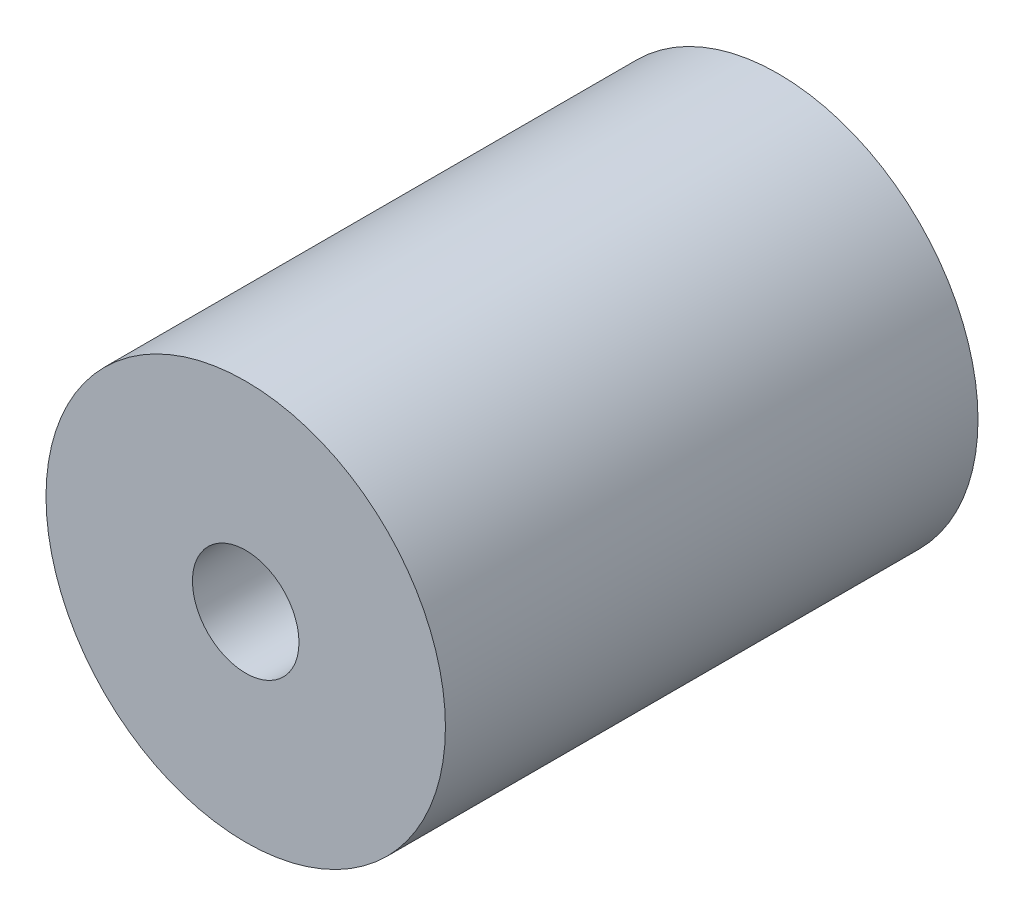
ISO-10303-21;
HEADER;
FILE_DESCRIPTION(('STEP AP214'),'2;1');
FILE_NAME('part.step','',(''),(''),'','','');
FILE_SCHEMA(('AUTOMOTIVE_DESIGN { 1 0 10303 214 1 1 1 1 }'));
ENDSEC;
DATA;
#1=APPLICATION_CONTEXT('core data for automotive mechanical design processes');
#2=APPLICATION_PROTOCOL_DEFINITION('international standard','automotive_design',2000,#1);
#3=PRODUCT_CONTEXT('',#1,'mechanical');
#4=PRODUCT('Part','Part','',(#3));
#5=PRODUCT_RELATED_PRODUCT_CATEGORY('part','',(#4));
#6=PRODUCT_DEFINITION_FORMATION('','',#4);
#7=PRODUCT_DEFINITION_CONTEXT('part definition',#1,'design');
#8=PRODUCT_DEFINITION('design','',#6,#7);
#9=PRODUCT_DEFINITION_SHAPE('','',#8);
#10=(LENGTH_UNIT() NAMED_UNIT(*) SI_UNIT(.MILLI.,.METRE.));
#11=(NAMED_UNIT(*) PLANE_ANGLE_UNIT() SI_UNIT($,.RADIAN.));
#12=(NAMED_UNIT(*) SI_UNIT($,.STERADIAN.) SOLID_ANGLE_UNIT());
#13=UNCERTAINTY_MEASURE_WITH_UNIT(LENGTH_MEASURE(1.E-05),#10,'distance_accuracy_value','');
#14=(GEOMETRIC_REPRESENTATION_CONTEXT(3) GLOBAL_UNCERTAINTY_ASSIGNED_CONTEXT((#13)) GLOBAL_UNIT_ASSIGNED_CONTEXT((#10,
#11,#12)) REPRESENTATION_CONTEXT('',''));
#15=CARTESIAN_POINT('',(0.,0.,0.));
#16=DIRECTION('',(0.,0.,1.));
#17=DIRECTION('',(1.,0.,0.));
#18=AXIS2_PLACEMENT_3D('',#15,#16,#17);
#19=CARTESIAN_POINT('',(0.,0.,40.));
#20=DIRECTION('',(0.,0.,-1.));
#21=DIRECTION('',(-1.,0.,0.));
#22=AXIS2_PLACEMENT_3D('',#19,#20,#21);
#23=CYLINDRICAL_SURFACE('',#22,15.);
#24=CARTESIAN_POINT('',(0.,0.,40.));
#25=DIRECTION('',(0.,0.,1.));
#26=DIRECTION('',(1.,0.,0.));
#27=AXIS2_PLACEMENT_3D('',#24,#25,#26);
#28=CIRCLE('',#27,15.);
#29=CARTESIAN_POINT('',(15.,0.,40.));
#30=VERTEX_POINT('',#29);
#31=EDGE_CURVE('E10',#30,#30,#28,.T.);
#32=ORIENTED_EDGE('',*,*,#31,.F.);
#33=EDGE_LOOP('',(#32));
#34=FACE_BOUND('',#33,.T.);
#35=CARTESIAN_POINT('',(0.,0.,0.));
#36=DIRECTION('',(0.,0.,1.));
#37=DIRECTION('',(1.,0.,0.));
#38=AXIS2_PLACEMENT_3D('',#35,#36,#37);
#39=CIRCLE('',#38,15.);
#40=CARTESIAN_POINT('',(15.,0.,0.));
#41=VERTEX_POINT('',#40);
#42=EDGE_CURVE('E39',#41,#41,#39,.T.);
#43=ORIENTED_EDGE('',*,*,#42,.T.);
#44=EDGE_LOOP('',(#43));
#45=FACE_BOUND('',#44,.T.);
#46=ADVANCED_FACE('F36',(#34,#45),#23,.T.);
#47=CARTESIAN_POINT('',(0.,0.,40.));
#48=DIRECTION('',(0.,0.,1.));
#49=DIRECTION('',(1.,0.,0.));
#50=AXIS2_PLACEMENT_3D('',#47,#48,#49);
#51=PLANE('',#50);
#52=CARTESIAN_POINT('',(0.,0.,40.));
#53=DIRECTION('',(0.,0.,1.));
#54=DIRECTION('',(1.,0.,0.));
#55=AXIS2_PLACEMENT_3D('',#52,#53,#54);
#56=CIRCLE('',#55,4.);
#57=CARTESIAN_POINT('',(4.,0.,40.));
#58=VERTEX_POINT('',#57);
#59=EDGE_CURVE('E48',#58,#58,#56,.T.);
#60=ORIENTED_EDGE('',*,*,#59,.F.);
#61=EDGE_LOOP('',(#60));
#62=FACE_BOUND('',#61,.T.);
#63=ORIENTED_EDGE('',*,*,#31,.T.);
#64=EDGE_LOOP('',(#63));
#65=FACE_BOUND('',#64,.T.);
#66=ADVANCED_FACE('F73',(#62,#65),#51,.T.);
#67=CARTESIAN_POINT('',(0.,0.,0.));
#68=DIRECTION('',(0.,0.,1.));
#69=DIRECTION('',(1.,0.,0.));
#70=AXIS2_PLACEMENT_3D('',#67,#68,#69);
#71=PLANE('',#70);
#72=CARTESIAN_POINT('',(0.,0.,0.));
#73=DIRECTION('',(0.,0.,-1.));
#74=DIRECTION('',(-1.,0.,0.));
#75=AXIS2_PLACEMENT_3D('',#72,#73,#74);
#76=CIRCLE('',#75,6.35);
#77=CARTESIAN_POINT('',(-6.35,0.,0.));
#78=VERTEX_POINT('',#77);
#79=EDGE_CURVE('E54',#78,#78,#76,.T.);
#80=ORIENTED_EDGE('',*,*,#79,.F.);
#81=EDGE_LOOP('',(#80));
#82=FACE_BOUND('',#81,.T.);
#83=ORIENTED_EDGE('',*,*,#42,.F.);
#84=EDGE_LOOP('',(#83));
#85=FACE_BOUND('',#84,.T.);
#86=ADVANCED_FACE('F69',(#82,#85),#71,.F.);
#87=CARTESIAN_POINT('',(0.,0.,25.));
#88=DIRECTION('',(0.,0.,1.));
#89=DIRECTION('',(1.,0.,0.));
#90=AXIS2_PLACEMENT_3D('',#87,#88,#89);
#91=CYLINDRICAL_SURFACE('',#90,4.);
#92=CARTESIAN_POINT('',(0.,0.,25.));
#93=DIRECTION('',(0.,0.,1.));
#94=DIRECTION('',(1.,0.,0.));
#95=AXIS2_PLACEMENT_3D('',#92,#93,#94);
#96=CIRCLE('',#95,4.);
#97=CARTESIAN_POINT('',(4.,0.,25.));
#98=VERTEX_POINT('',#97);
#99=EDGE_CURVE('E46',#98,#98,#96,.T.);
#100=ORIENTED_EDGE('',*,*,#99,.F.);
#101=EDGE_LOOP('',(#100));
#102=FACE_BOUND('',#101,.T.);
#103=ORIENTED_EDGE('',*,*,#59,.T.);
#104=EDGE_LOOP('',(#103));
#105=FACE_BOUND('',#104,.T.);
#106=ADVANCED_FACE('F72',(#102,#105),#91,.F.);
#107=CARTESIAN_POINT('',(0.,0.,25.));
#108=DIRECTION('',(0.,0.,1.));
#109=DIRECTION('',(1.,0.,0.));
#110=AXIS2_PLACEMENT_3D('',#107,#108,#109);
#111=PLANE('',#110);
#112=ORIENTED_EDGE('',*,*,#99,.T.);
#113=EDGE_LOOP('',(#112));
#114=FACE_BOUND('',#113,.T.);
#115=ADVANCED_FACE('F65',(#114),#111,.T.);
#116=CARTESIAN_POINT('',(0.,0.,15.));
#117=DIRECTION('',(0.,0.,-1.));
#118=DIRECTION('',(-1.,0.,0.));
#119=AXIS2_PLACEMENT_3D('',#116,#117,#118);
#120=CYLINDRICAL_SURFACE('',#119,6.35);
#121=CARTESIAN_POINT('',(0.,0.,15.));
#122=DIRECTION('',(0.,0.,-1.));
#123=DIRECTION('',(-1.,0.,0.));
#124=AXIS2_PLACEMENT_3D('',#121,#122,#123);
#125=CIRCLE('',#124,6.35);
#126=CARTESIAN_POINT('',(-6.35,0.,15.));
#127=VERTEX_POINT('',#126);
#128=EDGE_CURVE('E51',#127,#127,#125,.T.);
#129=ORIENTED_EDGE('',*,*,#128,.F.);
#130=EDGE_LOOP('',(#129));
#131=FACE_BOUND('',#130,.T.);
#132=ORIENTED_EDGE('',*,*,#79,.T.);
#133=EDGE_LOOP('',(#132));
#134=FACE_BOUND('',#133,.T.);
#135=ADVANCED_FACE('F62',(#131,#134),#120,.F.);
#136=CARTESIAN_POINT('',(0.,0.,15.));
#137=DIRECTION('',(0.,0.,-1.));
#138=DIRECTION('',(-1.,0.,0.));
#139=AXIS2_PLACEMENT_3D('',#136,#137,#138);
#140=PLANE('',#139);
#141=ORIENTED_EDGE('',*,*,#128,.T.);
#142=EDGE_LOOP('',(#141));
#143=FACE_BOUND('',#142,.T.);
#144=ADVANCED_FACE('F60',(#143),#140,.T.);
#145=CLOSED_SHELL('',(#46,#66,#86,#106,#115,#135,#144));
#146=MANIFOLD_SOLID_BREP('B2',#145);
#147=ADVANCED_BREP_SHAPE_REPRESENTATION('',(#18,#146),#14);
#148=SHAPE_DEFINITION_REPRESENTATION(#9,#147);
ENDSEC;
END-ISO-10303-21;
